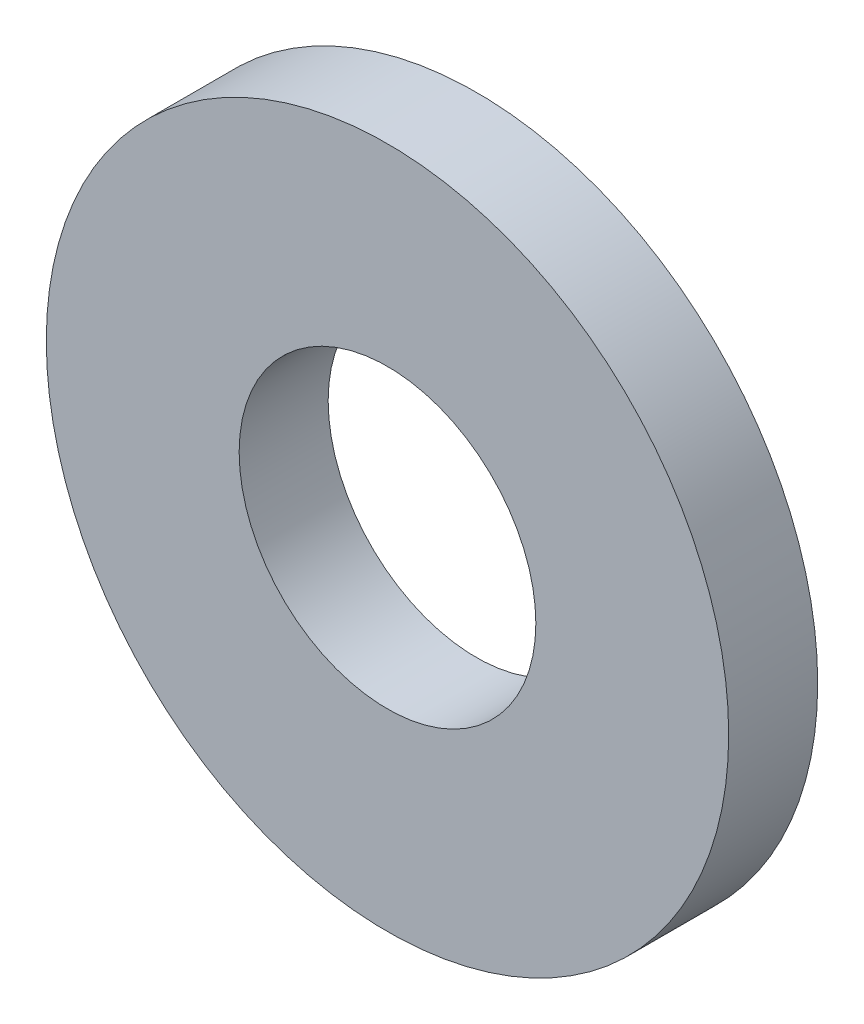
ISO-10303-21;
HEADER;
FILE_DESCRIPTION(('STEP AP214'),'2;1');
FILE_NAME('part.step','',(''),(''),'','','');
FILE_SCHEMA(('AUTOMOTIVE_DESIGN { 1 0 10303 214 1 1 1 1 }'));
ENDSEC;
DATA;
#1=APPLICATION_CONTEXT('core data for automotive mechanical design processes');
#2=APPLICATION_PROTOCOL_DEFINITION('international standard','automotive_design',2000,#1);
#3=PRODUCT_CONTEXT('',#1,'mechanical');
#4=PRODUCT('Part','Part','',(#3));
#5=PRODUCT_RELATED_PRODUCT_CATEGORY('part','',(#4));
#6=PRODUCT_DEFINITION_FORMATION('','',#4);
#7=PRODUCT_DEFINITION_CONTEXT('part definition',#1,'design');
#8=PRODUCT_DEFINITION('design','',#6,#7);
#9=PRODUCT_DEFINITION_SHAPE('','',#8);
#10=(LENGTH_UNIT() NAMED_UNIT(*) SI_UNIT(.MILLI.,.METRE.));
#11=(NAMED_UNIT(*) PLANE_ANGLE_UNIT() SI_UNIT($,.RADIAN.));
#12=(NAMED_UNIT(*) SI_UNIT($,.STERADIAN.) SOLID_ANGLE_UNIT());
#13=UNCERTAINTY_MEASURE_WITH_UNIT(LENGTH_MEASURE(1.E-05),#10,'distance_accuracy_value','');
#14=(GEOMETRIC_REPRESENTATION_CONTEXT(3) GLOBAL_UNCERTAINTY_ASSIGNED_CONTEXT((#13)) GLOBAL_UNIT_ASSIGNED_CONTEXT((#10,
#11,#12)) REPRESENTATION_CONTEXT('',''));
#15=CARTESIAN_POINT('',(0.,0.,0.));
#16=DIRECTION('',(0.,0.,1.));
#17=DIRECTION('',(1.,0.,0.));
#18=AXIS2_PLACEMENT_3D('',#15,#16,#17);
#19=CARTESIAN_POINT('',(0.,0.,0.));
#20=DIRECTION('',(0.,0.,1.));
#21=DIRECTION('',(1.,0.,0.));
#22=AXIS2_PLACEMENT_3D('',#19,#20,#21);
#23=PLANE('',#22);
#24=CARTESIAN_POINT('',(0.,0.,0.));
#25=DIRECTION('',(0.,0.,1.));
#26=DIRECTION('',(1.,0.,0.));
#27=AXIS2_PLACEMENT_3D('',#24,#25,#26);
#28=CIRCLE('',#27,5.);
#29=CARTESIAN_POINT('',(5.,0.,0.));
#30=VERTEX_POINT('',#29);
#31=EDGE_CURVE('E84',#30,#30,#28,.T.);
#32=ORIENTED_EDGE('',*,*,#31,.T.);
#33=EDGE_LOOP('',(#32));
#34=FACE_BOUND('',#33,.T.);
#35=CARTESIAN_POINT('',(0.,0.,0.));
#36=DIRECTION('',(0.,0.,1.));
#37=DIRECTION('',(1.,0.,0.));
#38=AXIS2_PLACEMENT_3D('',#35,#36,#37);
#39=CIRCLE('',#38,11.5);
#40=CARTESIAN_POINT('',(11.5,0.,0.));
#41=VERTEX_POINT('',#40);
#42=EDGE_CURVE('E10',#41,#41,#39,.T.);
#43=ORIENTED_EDGE('',*,*,#42,.F.);
#44=EDGE_LOOP('',(#43));
#45=FACE_BOUND('',#44,.T.);
#46=CARTESIAN_POINT('',(0.,8.,0.));
#47=DIRECTION('',(0.,0.,1.));
#48=DIRECTION('',(1.,0.,0.));
#49=AXIS2_PLACEMENT_3D('',#46,#47,#48);
#50=CIRCLE('',#49,2.65);
#51=CARTESIAN_POINT('',(2.65,8.,0.));
#52=VERTEX_POINT('',#51);
#53=EDGE_CURVE('E44',#52,#52,#50,.T.);
#54=ORIENTED_EDGE('',*,*,#53,.T.);
#55=EDGE_LOOP('',(#54));
#56=FACE_BOUND('',#55,.T.);
#57=CARTESIAN_POINT('',(8.,0.,0.));
#58=DIRECTION('',(0.,0.,1.));
#59=DIRECTION('',(1.,0.,0.));
#60=AXIS2_PLACEMENT_3D('',#57,#58,#59);
#61=CIRCLE('',#60,2.65);
#62=CARTESIAN_POINT('',(10.65,0.,0.));
#63=VERTEX_POINT('',#62);
#64=EDGE_CURVE('E49',#63,#63,#61,.T.);
#65=ORIENTED_EDGE('',*,*,#64,.T.);
#66=EDGE_LOOP('',(#65));
#67=FACE_BOUND('',#66,.T.);
#68=CARTESIAN_POINT('',(0.,-8.,0.));
#69=DIRECTION('',(0.,0.,1.));
#70=DIRECTION('',(-1.,0.,0.));
#71=AXIS2_PLACEMENT_3D('',#68,#69,#70);
#72=CIRCLE('',#71,2.65);
#73=CARTESIAN_POINT('',(-2.65,-8.,0.));
#74=VERTEX_POINT('',#73);
#75=EDGE_CURVE('E54',#74,#74,#72,.T.);
#76=ORIENTED_EDGE('',*,*,#75,.T.);
#77=EDGE_LOOP('',(#76));
#78=FACE_BOUND('',#77,.T.);
#79=CARTESIAN_POINT('',(-8.,0.,0.));
#80=DIRECTION('',(0.,0.,1.));
#81=DIRECTION('',(-1.,0.,0.));
#82=AXIS2_PLACEMENT_3D('',#79,#80,#81);
#83=CIRCLE('',#82,2.65);
#84=CARTESIAN_POINT('',(-10.65,0.,0.));
#85=VERTEX_POINT('',#84);
#86=EDGE_CURVE('E70',#85,#85,#83,.T.);
#87=ORIENTED_EDGE('',*,*,#86,.T.);
#88=EDGE_LOOP('',(#87));
#89=FACE_BOUND('',#88,.T.);
#90=ADVANCED_FACE('F36',(#34,#45,#56,#67,#78,#89),#23,.F.);
#91=CARTESIAN_POINT('',(0.,0.,2.));
#92=DIRECTION('',(0.,0.,-1.));
#93=DIRECTION('',(-1.,0.,0.));
#94=AXIS2_PLACEMENT_3D('',#91,#92,#93);
#95=CYLINDRICAL_SURFACE('',#94,11.5);
#96=ORIENTED_EDGE('',*,*,#42,.T.);
#97=EDGE_LOOP('',(#96));
#98=FACE_BOUND('',#97,.T.);
#99=CARTESIAN_POINT('',(0.,0.,3.));
#100=DIRECTION('',(0.,0.,1.));
#101=DIRECTION('',(1.,0.,0.));
#102=AXIS2_PLACEMENT_3D('',#99,#100,#101);
#103=CIRCLE('',#102,11.5);
#104=CARTESIAN_POINT('',(11.5,0.,3.));
#105=VERTEX_POINT('',#104);
#106=EDGE_CURVE('E80',#105,#105,#103,.T.);
#107=ORIENTED_EDGE('',*,*,#106,.F.);
#108=EDGE_LOOP('',(#107));
#109=FACE_BOUND('',#108,.T.);
#110=ADVANCED_FACE('F38',(#98,#109),#95,.T.);
#111=CARTESIAN_POINT('',(0.,8.,2.));
#112=DIRECTION('',(0.,0.,-1.));
#113=DIRECTION('',(-1.,0.,0.));
#114=AXIS2_PLACEMENT_3D('',#111,#112,#113);
#115=CYLINDRICAL_SURFACE('',#114,2.65);
#116=CARTESIAN_POINT('',(0.,8.,2.));
#117=DIRECTION('',(0.,0.,1.));
#118=DIRECTION('',(1.,0.,0.));
#119=AXIS2_PLACEMENT_3D('',#116,#117,#118);
#120=CIRCLE('',#119,2.65);
#121=CARTESIAN_POINT('',(2.65,8.,2.));
#122=VERTEX_POINT('',#121);
#123=EDGE_CURVE('E57',#122,#122,#120,.T.);
#124=ORIENTED_EDGE('',*,*,#123,.T.);
#125=EDGE_LOOP('',(#124));
#126=FACE_BOUND('',#125,.T.);
#127=ORIENTED_EDGE('',*,*,#53,.F.);
#128=EDGE_LOOP('',(#127));
#129=FACE_BOUND('',#128,.T.);
#130=ADVANCED_FACE('F104',(#126,#129),#115,.F.);
#131=CARTESIAN_POINT('',(8.,0.,2.));
#132=DIRECTION('',(0.,0.,-1.));
#133=DIRECTION('',(-1.,0.,0.));
#134=AXIS2_PLACEMENT_3D('',#131,#132,#133);
#135=CYLINDRICAL_SURFACE('',#134,2.65);
#136=CARTESIAN_POINT('',(8.,0.,2.));
#137=DIRECTION('',(0.,0.,1.));
#138=DIRECTION('',(1.,0.,0.));
#139=AXIS2_PLACEMENT_3D('',#136,#137,#138);
#140=CIRCLE('',#139,2.65);
#141=CARTESIAN_POINT('',(10.65,0.,2.));
#142=VERTEX_POINT('',#141);
#143=EDGE_CURVE('E61',#142,#142,#140,.T.);
#144=ORIENTED_EDGE('',*,*,#143,.T.);
#145=EDGE_LOOP('',(#144));
#146=FACE_BOUND('',#145,.T.);
#147=ORIENTED_EDGE('',*,*,#64,.F.);
#148=EDGE_LOOP('',(#147));
#149=FACE_BOUND('',#148,.T.);
#150=ADVANCED_FACE('F109',(#146,#149),#135,.F.);
#151=CARTESIAN_POINT('',(0.,-8.,2.));
#152=DIRECTION('',(0.,0.,-1.));
#153=DIRECTION('',(-1.,0.,0.));
#154=AXIS2_PLACEMENT_3D('',#151,#152,#153);
#155=CYLINDRICAL_SURFACE('',#154,2.65);
#156=CARTESIAN_POINT('',(0.,-8.,2.));
#157=DIRECTION('',(0.,0.,1.));
#158=DIRECTION('',(-1.,0.,0.));
#159=AXIS2_PLACEMENT_3D('',#156,#157,#158);
#160=CIRCLE('',#159,2.65);
#161=CARTESIAN_POINT('',(-2.65,-8.,2.));
#162=VERTEX_POINT('',#161);
#163=EDGE_CURVE('E60',#162,#162,#160,.T.);
#164=ORIENTED_EDGE('',*,*,#163,.T.);
#165=EDGE_LOOP('',(#164));
#166=FACE_BOUND('',#165,.T.);
#167=ORIENTED_EDGE('',*,*,#75,.F.);
#168=EDGE_LOOP('',(#167));
#169=FACE_BOUND('',#168,.T.);
#170=ADVANCED_FACE('F120',(#166,#169),#155,.F.);
#171=CARTESIAN_POINT('',(-8.,0.,2.));
#172=DIRECTION('',(0.,0.,-1.));
#173=DIRECTION('',(-1.,0.,0.));
#174=AXIS2_PLACEMENT_3D('',#171,#172,#173);
#175=CYLINDRICAL_SURFACE('',#174,2.65);
#176=CARTESIAN_POINT('',(-8.,0.,2.));
#177=DIRECTION('',(0.,0.,1.));
#178=DIRECTION('',(-1.,0.,0.));
#179=AXIS2_PLACEMENT_3D('',#176,#177,#178);
#180=CIRCLE('',#179,2.65);
#181=CARTESIAN_POINT('',(-10.65,0.,2.));
#182=VERTEX_POINT('',#181);
#183=EDGE_CURVE('E66',#182,#182,#180,.T.);
#184=ORIENTED_EDGE('',*,*,#183,.T.);
#185=EDGE_LOOP('',(#184));
#186=FACE_BOUND('',#185,.T.);
#187=ORIENTED_EDGE('',*,*,#86,.F.);
#188=EDGE_LOOP('',(#187));
#189=FACE_BOUND('',#188,.T.);
#190=ADVANCED_FACE('F124',(#186,#189),#175,.F.);
#191=CARTESIAN_POINT('',(0.,0.,2.));
#192=DIRECTION('',(0.,0.,1.));
#193=DIRECTION('',(1.,0.,0.));
#194=AXIS2_PLACEMENT_3D('',#191,#192,#193);
#195=PLANE('',#194);
#196=ORIENTED_EDGE('',*,*,#183,.F.);
#197=EDGE_LOOP('',(#196));
#198=FACE_BOUND('',#197,.T.);
#199=ADVANCED_FACE('F128',(#198),#195,.F.);
#200=ORIENTED_EDGE('',*,*,#143,.F.);
#201=EDGE_LOOP('',(#200));
#202=FACE_BOUND('',#201,.T.);
#203=ADVANCED_FACE('F152',(#202),#195,.F.);
#204=ORIENTED_EDGE('',*,*,#123,.F.);
#205=EDGE_LOOP('',(#204));
#206=FACE_BOUND('',#205,.T.);
#207=ADVANCED_FACE('F131',(#206),#195,.F.);
#208=ORIENTED_EDGE('',*,*,#163,.F.);
#209=EDGE_LOOP('',(#208));
#210=FACE_BOUND('',#209,.T.);
#211=ADVANCED_FACE('F99',(#210),#195,.F.);
#212=CARTESIAN_POINT('',(0.,0.,3.));
#213=DIRECTION('',(0.,0.,1.));
#214=DIRECTION('',(1.,0.,0.));
#215=AXIS2_PLACEMENT_3D('',#212,#213,#214);
#216=PLANE('',#215);
#217=CARTESIAN_POINT('',(0.,0.,3.));
#218=DIRECTION('',(0.,0.,1.));
#219=DIRECTION('',(1.,0.,0.));
#220=AXIS2_PLACEMENT_3D('',#217,#218,#219);
#221=CIRCLE('',#220,5.);
#222=CARTESIAN_POINT('',(5.,0.,3.));
#223=VERTEX_POINT('',#222);
#224=EDGE_CURVE('E88',#223,#223,#221,.T.);
#225=ORIENTED_EDGE('',*,*,#224,.F.);
#226=EDGE_LOOP('',(#225));
#227=FACE_BOUND('',#226,.T.);
#228=ORIENTED_EDGE('',*,*,#106,.T.);
#229=EDGE_LOOP('',(#228));
#230=FACE_BOUND('',#229,.T.);
#231=ADVANCED_FACE('F96',(#227,#230),#216,.T.);
#232=CARTESIAN_POINT('',(0.,0.,-7.));
#233=DIRECTION('',(0.,0.,1.));
#234=DIRECTION('',(1.,0.,0.));
#235=AXIS2_PLACEMENT_3D('',#232,#233,#234);
#236=CYLINDRICAL_SURFACE('',#235,5.);
#237=ORIENTED_EDGE('',*,*,#224,.T.);
#238=EDGE_LOOP('',(#237));
#239=FACE_BOUND('',#238,.T.);
#240=ORIENTED_EDGE('',*,*,#31,.F.);
#241=EDGE_LOOP('',(#240));
#242=FACE_BOUND('',#241,.T.);
#243=ADVANCED_FACE('F93',(#239,#242),#236,.F.);
#244=CLOSED_SHELL('',(#90,#110,#130,#150,#170,#190,#199,#203,#207,#211,#231,#243));
#245=MANIFOLD_SOLID_BREP('B2',#244);
#246=ADVANCED_BREP_SHAPE_REPRESENTATION('',(#18,#245),#14);
#247=SHAPE_DEFINITION_REPRESENTATION(#9,#246);
ENDSEC;
END-ISO-10303-21;
